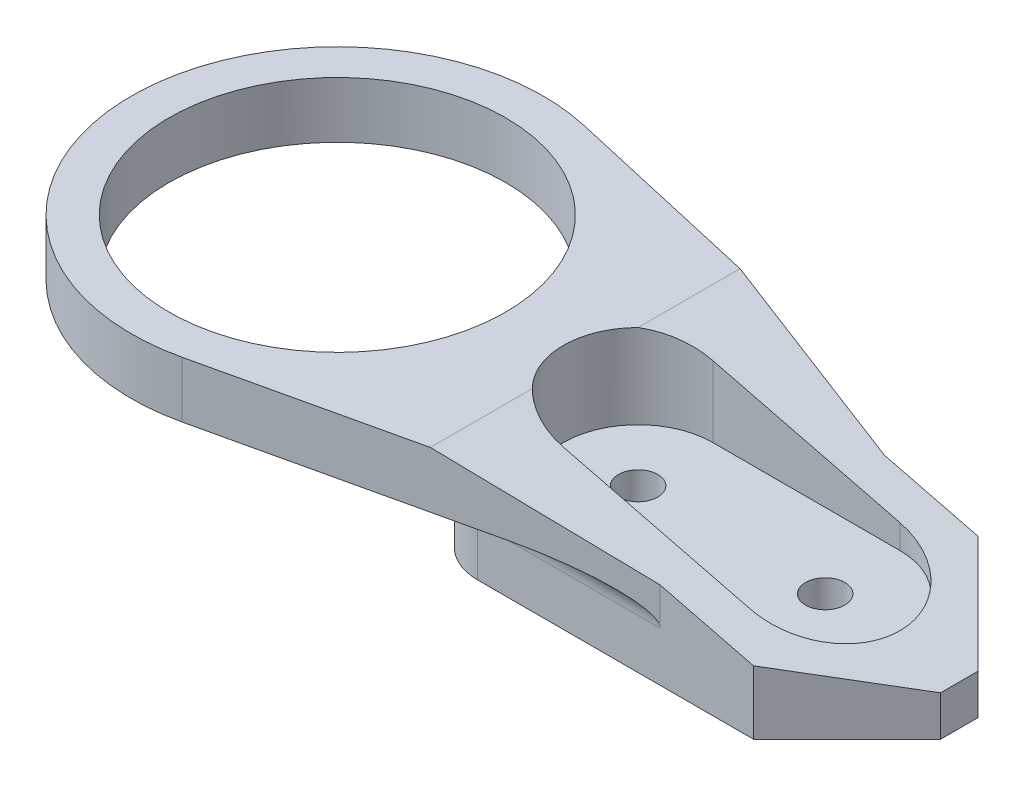
ISO-10303-21;
HEADER;
FILE_DESCRIPTION(('STEP AP214'),'2;1');
FILE_NAME('part.step','',(''),(''),'','','');
FILE_SCHEMA(('AUTOMOTIVE_DESIGN { 1 0 10303 214 1 1 1 1 }'));
ENDSEC;
DATA;
#1=APPLICATION_CONTEXT('core data for automotive mechanical design processes');
#2=APPLICATION_PROTOCOL_DEFINITION('international standard','automotive_design',2000,#1);
#3=PRODUCT_CONTEXT('',#1,'mechanical');
#4=PRODUCT('Part','Part','',(#3));
#5=PRODUCT_RELATED_PRODUCT_CATEGORY('part','',(#4));
#6=PRODUCT_DEFINITION_FORMATION('','',#4);
#7=PRODUCT_DEFINITION_CONTEXT('part definition',#1,'design');
#8=PRODUCT_DEFINITION('design','',#6,#7);
#9=PRODUCT_DEFINITION_SHAPE('','',#8);
#10=(LENGTH_UNIT() NAMED_UNIT(*) SI_UNIT(.MILLI.,.METRE.));
#11=(NAMED_UNIT(*) PLANE_ANGLE_UNIT() SI_UNIT($,.RADIAN.));
#12=(NAMED_UNIT(*) SI_UNIT($,.STERADIAN.) SOLID_ANGLE_UNIT());
#13=UNCERTAINTY_MEASURE_WITH_UNIT(LENGTH_MEASURE(1.E-05),#10,'distance_accuracy_value','');
#14=(GEOMETRIC_REPRESENTATION_CONTEXT(3) GLOBAL_UNCERTAINTY_ASSIGNED_CONTEXT((#13)) GLOBAL_UNIT_ASSIGNED_CONTEXT((#10,
#11,#12)) REPRESENTATION_CONTEXT('',''));
#15=CARTESIAN_POINT('',(0.,0.,0.));
#16=DIRECTION('',(0.,0.,1.));
#17=DIRECTION('',(1.,0.,0.));
#18=AXIS2_PLACEMENT_3D('',#15,#16,#17);
#19=CARTESIAN_POINT('',(17.8298933663439,-2.85,6.));
#20=DIRECTION('',(0.,1.,0.));
#21=DIRECTION('',(0.,0.,1.));
#22=AXIS2_PLACEMENT_3D('',#19,#20,#21);
#23=CYLINDRICAL_SURFACE('',#22,1.05);
#24=CARTESIAN_POINT('',(17.8298933663439,0.,6.));
#25=DIRECTION('',(0.,1.,0.));
#26=DIRECTION('',(-1.,0.,0.));
#27=AXIS2_PLACEMENT_3D('',#24,#25,#26);
#28=CIRCLE('',#27,1.05);
#29=CARTESIAN_POINT('',(16.7798933663439,0.,6.));
#30=VERTEX_POINT('',#29);
#31=EDGE_CURVE('E231',#30,#30,#28,.T.);
#32=ORIENTED_EDGE('',*,*,#31,.F.);
#33=EDGE_LOOP('',(#32));
#34=FACE_BOUND('',#33,.T.);
#35=CARTESIAN_POINT('',(17.8298933663439,2.65,6.));
#36=DIRECTION('',(0.,1.,0.));
#37=DIRECTION('',(0.,0.,1.));
#38=AXIS2_PLACEMENT_3D('',#35,#36,#37);
#39=CIRCLE('',#38,1.05);
#40=CARTESIAN_POINT('',(17.8298933663439,2.65,7.05));
#41=VERTEX_POINT('',#40);
#42=EDGE_CURVE('E228',#41,#41,#39,.F.);
#43=ORIENTED_EDGE('',*,*,#42,.F.);
#44=EDGE_LOOP('',(#43));
#45=FACE_BOUND('',#44,.T.);
#46=ADVANCED_FACE('F40',(#34,#45),#23,.F.);
#47=CARTESIAN_POINT('',(7.82989336634394,-2.85,6.));
#48=DIRECTION('',(0.,1.,0.));
#49=DIRECTION('',(0.,0.,1.));
#50=AXIS2_PLACEMENT_3D('',#47,#48,#49);
#51=CYLINDRICAL_SURFACE('',#50,1.05);
#52=CARTESIAN_POINT('',(7.82989336634394,0.,6.));
#53=DIRECTION('',(0.,1.,0.));
#54=DIRECTION('',(-1.,0.,0.));
#55=AXIS2_PLACEMENT_3D('',#52,#53,#54);
#56=CIRCLE('',#55,1.05);
#57=CARTESIAN_POINT('',(6.77989336634394,0.,6.));
#58=VERTEX_POINT('',#57);
#59=EDGE_CURVE('E234',#58,#58,#56,.T.);
#60=ORIENTED_EDGE('',*,*,#59,.F.);
#61=EDGE_LOOP('',(#60));
#62=FACE_BOUND('',#61,.T.);
#63=CARTESIAN_POINT('',(7.82989336634394,2.65,6.));
#64=DIRECTION('',(0.,1.,0.));
#65=DIRECTION('',(0.,0.,1.));
#66=AXIS2_PLACEMENT_3D('',#63,#64,#65);
#67=CIRCLE('',#66,1.05);
#68=CARTESIAN_POINT('',(7.82989336634394,2.65,7.05));
#69=VERTEX_POINT('',#68);
#70=EDGE_CURVE('E223',#69,#69,#67,.F.);
#71=ORIENTED_EDGE('',*,*,#70,.F.);
#72=EDGE_LOOP('',(#71));
#73=FACE_BOUND('',#72,.T.);
#74=ADVANCED_FACE('F465',(#62,#73),#51,.F.);
#75=CARTESIAN_POINT('',(0.,0.,12.));
#76=DIRECTION('',(0.,0.,-1.));
#77=DIRECTION('',(-1.,0.,0.));
#78=AXIS2_PLACEMENT_3D('',#75,#76,#77);
#79=PLANE('',#78);
#80=DIRECTION('',(0.,1.,0.));
#81=VECTOR('',#80,1.);
#82=CARTESIAN_POINT('',(15.,4.15,12.));
#83=LINE('',#82,#81);
#84=CARTESIAN_POINT('',(15.,2.65,12.));
#85=VERTEX_POINT('',#84);
#86=CARTESIAN_POINT('',(15.,4.64999999999996,12.));
#87=VERTEX_POINT('',#86);
#88=EDGE_CURVE('E263',#85,#87,#83,.T.);
#89=ORIENTED_EDGE('',*,*,#88,.F.);
#90=DIRECTION('',(1.,0.,0.));
#91=VECTOR('',#90,1.);
#92=CARTESIAN_POINT('',(5.25,2.65,12.));
#93=LINE('',#92,#91);
#94=CARTESIAN_POINT('',(5.25,2.65,12.));
#95=VERTEX_POINT('',#94);
#96=EDGE_CURVE('E349',#85,#95,#93,.F.);
#97=ORIENTED_EDGE('',*,*,#96,.T.);
#98=DIRECTION('',(0.,1.,0.));
#99=VECTOR('',#98,1.);
#100=CARTESIAN_POINT('',(5.25,0.,12.));
#101=LINE('',#100,#99);
#102=CARTESIAN_POINT('',(5.25,0.,12.));
#103=VERTEX_POINT('',#102);
#104=EDGE_CURVE('E328',#95,#103,#101,.F.);
#105=ORIENTED_EDGE('',*,*,#104,.T.);
#106=DIRECTION('',(1.,0.,0.));
#107=VECTOR('',#106,1.);
#108=CARTESIAN_POINT('',(25.,0.,12.));
#109=LINE('',#108,#107);
#110=CARTESIAN_POINT('',(20.,0.,12.));
#111=VERTEX_POINT('',#110);
#112=EDGE_CURVE('E271',#103,#111,#109,.T.);
#113=ORIENTED_EDGE('',*,*,#112,.T.);
#114=DIRECTION('',(0.,1.,0.));
#115=VECTOR('',#114,1.);
#116=CARTESIAN_POINT('',(20.,0.,12.));
#117=LINE('',#116,#115);
#118=CARTESIAN_POINT('',(20.,3.39999999999998,12.));
#119=VERTEX_POINT('',#118);
#120=EDGE_CURVE('E293',#111,#119,#117,.T.);
#121=ORIENTED_EDGE('',*,*,#120,.T.);
#122=DIRECTION('',(0.970142500145333,-0.24253562503633,0.));
#123=VECTOR('',#122,1.);
#124=CARTESIAN_POINT('',(4.99999999999971,7.15,12.));
#125=LINE('',#124,#123);
#126=EDGE_CURVE('E289',#119,#87,#125,.F.);
#127=ORIENTED_EDGE('',*,*,#126,.T.);
#128=EDGE_LOOP('',(#89,#97,#105,#113,#121,#127));
#129=FACE_BOUND('',#128,.T.);
#130=ADVANCED_FACE('F446',(#129),#79,.F.);
#131=CARTESIAN_POINT('',(25.,0.,12.));
#132=DIRECTION('',(0.,1.,0.));
#133=DIRECTION('',(-1.,0.,0.));
#134=AXIS2_PLACEMENT_3D('',#131,#132,#133);
#135=PLANE('',#134);
#136=ORIENTED_EDGE('',*,*,#59,.T.);
#137=EDGE_LOOP('',(#136));
#138=FACE_BOUND('',#137,.T.);
#139=ORIENTED_EDGE('',*,*,#31,.T.);
#140=EDGE_LOOP('',(#139));
#141=FACE_BOUND('',#140,.T.);
#142=ORIENTED_EDGE('',*,*,#112,.F.);
#143=CARTESIAN_POINT('',(5.25,0.,9.));
#144=DIRECTION('',(0.,1.,0.));
#145=DIRECTION('',(-1.,0.,0.));
#146=AXIS2_PLACEMENT_3D('',#143,#144,#145);
#147=CIRCLE('',#146,3.);
#148=CARTESIAN_POINT('',(2.25,0.,9.));
#149=VERTEX_POINT('',#148);
#150=EDGE_CURVE('E332',#103,#149,#147,.F.);
#151=ORIENTED_EDGE('',*,*,#150,.T.);
#152=DIRECTION('',(0.,0.,1.));
#153=VECTOR('',#152,1.);
#154=CARTESIAN_POINT('',(2.25,0.,12.));
#155=LINE('',#154,#153);
#156=CARTESIAN_POINT('',(2.25,0.,3.));
#157=VERTEX_POINT('',#156);
#158=EDGE_CURVE('E243',#157,#149,#155,.T.);
#159=ORIENTED_EDGE('',*,*,#158,.F.);
#160=CARTESIAN_POINT('',(5.25,0.,3.));
#161=DIRECTION('',(0.,1.,0.));
#162=DIRECTION('',(-1.,0.,0.));
#163=AXIS2_PLACEMENT_3D('',#160,#161,#162);
#164=CIRCLE('',#163,3.);
#165=CARTESIAN_POINT('',(5.25,0.,0.));
#166=VERTEX_POINT('',#165);
#167=EDGE_CURVE('E330',#157,#166,#164,.F.);
#168=ORIENTED_EDGE('',*,*,#167,.T.);
#169=DIRECTION('',(1.,0.,0.));
#170=VECTOR('',#169,1.);
#171=CARTESIAN_POINT('',(25.,0.,0.));
#172=LINE('',#171,#170);
#173=CARTESIAN_POINT('',(20.,0.,0.));
#174=VERTEX_POINT('',#173);
#175=EDGE_CURVE('E262',#166,#174,#172,.T.);
#176=ORIENTED_EDGE('',*,*,#175,.T.);
#177=DIRECTION('',(0.707106781186549,0.,0.707106781186547));
#178=VECTOR('',#177,1.);
#179=CARTESIAN_POINT('',(25.,0.,5.00000000000001));
#180=LINE('',#179,#178);
#181=CARTESIAN_POINT('',(25.,0.,5.00000000000001));
#182=VERTEX_POINT('',#181);
#183=EDGE_CURVE('E305',#174,#182,#180,.T.);
#184=ORIENTED_EDGE('',*,*,#183,.T.);
#185=DIRECTION('',(0.,0.,-1.));
#186=VECTOR('',#185,1.);
#187=CARTESIAN_POINT('',(25.,0.,12.));
#188=LINE('',#187,#186);
#189=CARTESIAN_POINT('',(25.,0.,6.99999999999997));
#190=VERTEX_POINT('',#189);
#191=EDGE_CURVE('E273',#190,#182,#188,.T.);
#192=ORIENTED_EDGE('',*,*,#191,.F.);
#193=DIRECTION('',(0.707106781186547,0.,-0.707106781186549));
#194=VECTOR('',#193,1.);
#195=CARTESIAN_POINT('',(20.,0.,12.));
#196=LINE('',#195,#194);
#197=EDGE_CURVE('E307',#190,#111,#196,.F.);
#198=ORIENTED_EDGE('',*,*,#197,.T.);
#199=EDGE_LOOP('',(#142,#151,#159,#168,#176,#184,#192,#198));
#200=FACE_BOUND('',#199,.T.);
#201=ADVANCED_FACE('F389',(#138,#141,#200),#135,.F.);
#202=CARTESIAN_POINT('',(0.,0.,0.));
#203=DIRECTION('',(0.,0.,-1.));
#204=DIRECTION('',(-1.,0.,0.));
#205=AXIS2_PLACEMENT_3D('',#202,#203,#204);
#206=PLANE('',#205);
#207=DIRECTION('',(0.,1.,0.));
#208=VECTOR('',#207,1.);
#209=CARTESIAN_POINT('',(5.25,0.,0.));
#210=LINE('',#209,#208);
#211=CARTESIAN_POINT('',(5.25,2.65,0.));
#212=VERTEX_POINT('',#211);
#213=EDGE_CURVE('E334',#166,#212,#210,.T.);
#214=ORIENTED_EDGE('',*,*,#213,.T.);
#215=DIRECTION('',(-1.,0.,0.));
#216=VECTOR('',#215,1.);
#217=CARTESIAN_POINT('',(0.,2.65,0.));
#218=LINE('',#217,#216);
#219=CARTESIAN_POINT('',(15.,2.65,0.));
#220=VERTEX_POINT('',#219);
#221=EDGE_CURVE('E356',#212,#220,#218,.F.);
#222=ORIENTED_EDGE('',*,*,#221,.T.);
#223=DIRECTION('',(0.,1.,0.));
#224=VECTOR('',#223,1.);
#225=CARTESIAN_POINT('',(15.,4.15,0.));
#226=LINE('',#225,#224);
#227=CARTESIAN_POINT('',(15.,4.64999999999996,0.));
#228=VERTEX_POINT('',#227);
#229=EDGE_CURVE('E56',#220,#228,#226,.T.);
#230=ORIENTED_EDGE('',*,*,#229,.T.);
#231=DIRECTION('',(-0.970142500145333,0.24253562503633,0.));
#232=VECTOR('',#231,1.);
#233=CARTESIAN_POINT('',(1.97647058823525,7.9058823529411,0.));
#234=LINE('',#233,#232);
#235=CARTESIAN_POINT('',(20.,3.39999999999998,0.));
#236=VERTEX_POINT('',#235);
#237=EDGE_CURVE('E283',#228,#236,#234,.F.);
#238=ORIENTED_EDGE('',*,*,#237,.T.);
#239=DIRECTION('',(0.,-1.,0.));
#240=VECTOR('',#239,1.);
#241=CARTESIAN_POINT('',(20.,0.,0.));
#242=LINE('',#241,#240);
#243=EDGE_CURVE('E310',#236,#174,#242,.T.);
#244=ORIENTED_EDGE('',*,*,#243,.T.);
#245=ORIENTED_EDGE('',*,*,#175,.F.);
#246=EDGE_LOOP('',(#214,#222,#230,#238,#244,#245));
#247=FACE_BOUND('',#246,.T.);
#248=ADVANCED_FACE('F381',(#247),#206,.T.);
#249=CARTESIAN_POINT('',(25.,7.15,12.));
#250=DIRECTION('',(-1.,0.,0.));
#251=DIRECTION('',(0.,0.,1.));
#252=AXIS2_PLACEMENT_3D('',#249,#250,#251);
#253=PLANE('',#252);
#254=DIRECTION('',(0.,0.,1.));
#255=VECTOR('',#254,1.);
#256=CARTESIAN_POINT('',(25.,2.14999999999999,12.));
#257=LINE('',#256,#255);
#258=CARTESIAN_POINT('',(25.,2.14999999999999,5.00000000000001));
#259=VERTEX_POINT('',#258);
#260=CARTESIAN_POINT('',(25.,2.14999999999999,6.99999999999997));
#261=VERTEX_POINT('',#260);
#262=EDGE_CURVE('E286',#259,#261,#257,.T.);
#263=ORIENTED_EDGE('',*,*,#262,.T.);
#264=DIRECTION('',(0.,-1.,0.));
#265=VECTOR('',#264,1.);
#266=CARTESIAN_POINT('',(25.,7.15,6.99999999999997));
#267=LINE('',#266,#265);
#268=EDGE_CURVE('E303',#261,#190,#267,.T.);
#269=ORIENTED_EDGE('',*,*,#268,.T.);
#270=ORIENTED_EDGE('',*,*,#191,.T.);
#271=DIRECTION('',(0.,1.,0.));
#272=VECTOR('',#271,1.);
#273=CARTESIAN_POINT('',(25.,2.14999999999999,5.00000000000001));
#274=LINE('',#273,#272);
#275=EDGE_CURVE('E300',#182,#259,#274,.T.);
#276=ORIENTED_EDGE('',*,*,#275,.T.);
#277=EDGE_LOOP('',(#263,#269,#270,#276));
#278=FACE_BOUND('',#277,.T.);
#279=ADVANCED_FACE('F440',(#278),#253,.F.);
#280=CARTESIAN_POINT('',(0.,7.15,12.));
#281=DIRECTION('',(0.,-1.,0.));
#282=DIRECTION('',(0.,0.,-1.));
#283=AXIS2_PLACEMENT_3D('',#280,#281,#282);
#284=PLANE('',#283);
#285=CARTESIAN_POINT('',(-8.25,7.15,6.));
#286=DIRECTION('',(0.,-1.,0.));
#287=DIRECTION('',(0.,0.,-1.));
#288=AXIS2_PLACEMENT_3D('',#285,#286,#287);
#289=CIRCLE('',#288,9.);
#290=CARTESIAN_POINT('',(-8.25,7.15,-3.));
#291=VERTEX_POINT('',#290);
#292=EDGE_CURVE('E240',#291,#291,#289,.T.);
#293=ORIENTED_EDGE('',*,*,#292,.T.);
#294=EDGE_LOOP('',(#293));
#295=FACE_BOUND('',#294,.T.);
#296=DIRECTION('',(0.,0.,-1.));
#297=VECTOR('',#296,1.);
#298=CARTESIAN_POINT('',(4.99999999999971,7.15,12.));
#299=LINE('',#298,#297);
#300=CARTESIAN_POINT('',(4.99999999999971,7.15,14.2771102196746));
#301=VERTEX_POINT('',#300);
#302=CARTESIAN_POINT('',(4.99999999999971,7.15,8.82696012266195));
#303=VERTEX_POINT('',#302);
#304=EDGE_CURVE('E278',#301,#303,#299,.T.);
#305=ORIENTED_EDGE('',*,*,#304,.T.);
#306=CARTESIAN_POINT('',(7.82989336634394,7.15,6.));
#307=DIRECTION('',(0.,1.,0.));
#308=DIRECTION('',(0.,0.,1.));
#309=AXIS2_PLACEMENT_3D('',#306,#307,#308);
#310=CIRCLE('',#309,4.);
#311=CARTESIAN_POINT('',(4.99999999999971,7.15,3.17303987733804));
#312=VERTEX_POINT('',#311);
#313=EDGE_CURVE('E215',#312,#303,#310,.T.);
#314=ORIENTED_EDGE('',*,*,#313,.F.);
#315=CARTESIAN_POINT('',(4.99999999999971,7.15,-2.27711021967455));
#316=VERTEX_POINT('',#315);
#317=EDGE_CURVE('E277',#312,#316,#299,.T.);
#318=ORIENTED_EDGE('',*,*,#317,.T.);
#319=DIRECTION('',(-0.975040415413256,0.,-0.222027449453318));
#320=VECTOR('',#319,1.);
#321=CARTESIAN_POINT('',(0.739442824661187,7.15,-3.24728604822164));
#322=LINE('',#321,#320);
#323=CARTESIAN_POINT('',(-5.80494920248651,7.15,-4.73751624487906));
#324=VERTEX_POINT('',#323);
#325=EDGE_CURVE('E246',#316,#324,#322,.T.);
#326=ORIENTED_EDGE('',*,*,#325,.T.);
#327=CARTESIAN_POINT('',(-8.25,7.15,6.));
#328=DIRECTION('',(0.,1.,0.));
#329=DIRECTION('',(0.,0.,1.));
#330=AXIS2_PLACEMENT_3D('',#327,#328,#329);
#331=CIRCLE('',#330,11.0123806922692);
#332=CARTESIAN_POINT('',(-5.80494920248651,7.15,16.7375162448791));
#333=VERTEX_POINT('',#332);
#334=EDGE_CURVE('E257',#324,#333,#331,.T.);
#335=ORIENTED_EDGE('',*,*,#334,.T.);
#336=DIRECTION('',(-0.975040415413256,0.,0.222027449453318));
#337=VECTOR('',#336,1.);
#338=CARTESIAN_POINT('',(3.3372716632385,7.15,14.6557317884927));
#339=LINE('',#338,#337);
#340=EDGE_CURVE('E250',#301,#333,#339,.T.);
#341=ORIENTED_EDGE('',*,*,#340,.F.);
#342=EDGE_LOOP('',(#305,#314,#318,#326,#335,#341));
#343=FACE_BOUND('',#342,.T.);
#344=ADVANCED_FACE('F423',(#295,#343),#284,.F.);
#345=CARTESIAN_POINT('',(0.739442824661187,4.15,-3.24728604822164));
#346=DIRECTION('',(0.222027449453318,0.,-0.975040415413256));
#347=DIRECTION('',(-0.975040415413256,0.,-0.222027449453318));
#348=AXIS2_PLACEMENT_3D('',#345,#346,#347);
#349=PLANE('',#348);
#350=ORIENTED_EDGE('',*,*,#325,.F.);
#351=DIRECTION('',(-0.947302626103098,0.236825656525771,-0.215711249102385));
#352=VECTOR('',#351,1.);
#353=CARTESIAN_POINT('',(1.65143880185032,7.98714029953734,-3.0396145122257));
#354=LINE('',#353,#352);
#355=EDGE_CURVE('E281',#316,#228,#354,.F.);
#356=ORIENTED_EDGE('',*,*,#355,.T.);
#357=ORIENTED_EDGE('',*,*,#229,.F.);
#358=CARTESIAN_POINT('',(8.41270357912484,2.65,-1.5));
#359=DIRECTION('',(0.222027449453318,0.,-0.975040415413256));
#360=DIRECTION('',(-0.975040415413256,0.,-0.222027449453318));
#361=AXIS2_PLACEMENT_3D('',#358,#359,#360);
#362=ELLIPSE('',#361,6.75592141284034,1.5);
#363=CARTESIAN_POINT('',(8.41270357912484,4.15,-1.5));
#364=VERTEX_POINT('',#363);
#365=EDGE_CURVE('E11',#220,#364,#362,.F.);
#366=ORIENTED_EDGE('',*,*,#365,.T.);
#367=DIRECTION('',(-0.975040415413256,0.,-0.222027449453318));
#368=VECTOR('',#367,1.);
#369=CARTESIAN_POINT('',(0.739442824661187,4.15,-3.24728604822164));
#370=LINE('',#369,#368);
#371=CARTESIAN_POINT('',(-5.80494920248651,4.15,-4.73751624487906));
#372=VERTEX_POINT('',#371);
#373=EDGE_CURVE('E247',#364,#372,#370,.T.);
#374=ORIENTED_EDGE('',*,*,#373,.T.);
#375=DIRECTION('',(0.,1.,0.));
#376=VECTOR('',#375,1.);
#377=CARTESIAN_POINT('',(-5.80494920248651,4.15,-4.73751624487906));
#378=LINE('',#377,#376);
#379=EDGE_CURVE('E255',#372,#324,#378,.T.);
#380=ORIENTED_EDGE('',*,*,#379,.T.);
#381=EDGE_LOOP('',(#350,#356,#357,#366,#374,#380));
#382=FACE_BOUND('',#381,.T.);
#383=ADVANCED_FACE('F421',(#382),#349,.T.);
#384=CARTESIAN_POINT('',(3.3372716632385,4.15,14.6557317884927));
#385=DIRECTION('',(-0.222027449453318,0.,-0.975040415413256));
#386=DIRECTION('',(-0.975040415413256,0.,0.222027449453318));
#387=AXIS2_PLACEMENT_3D('',#384,#385,#386);
#388=PLANE('',#387);
#389=ORIENTED_EDGE('',*,*,#88,.T.);
#390=DIRECTION('',(0.947302626103098,-0.236825656525771,-0.215711249102385));
#391=VECTOR('',#390,1.);
#392=CARTESIAN_POINT('',(5.46531342989284,7.03367164252672,14.1711532230184));
#393=LINE('',#392,#391);
#394=EDGE_CURVE('E291',#87,#301,#393,.F.);
#395=ORIENTED_EDGE('',*,*,#394,.T.);
#396=ORIENTED_EDGE('',*,*,#340,.T.);
#397=DIRECTION('',(0.,1.,0.));
#398=VECTOR('',#397,1.);
#399=CARTESIAN_POINT('',(-5.80494920248651,4.15,16.7375162448791));
#400=LINE('',#399,#398);
#401=CARTESIAN_POINT('',(-5.80494920248651,4.15,16.7375162448791));
#402=VERTEX_POINT('',#401);
#403=EDGE_CURVE('E266',#402,#333,#400,.T.);
#404=ORIENTED_EDGE('',*,*,#403,.F.);
#405=DIRECTION('',(-0.975040415413256,0.,0.222027449453318));
#406=VECTOR('',#405,1.);
#407=CARTESIAN_POINT('',(3.3372716632385,4.15,14.6557317884927));
#408=LINE('',#407,#406);
#409=CARTESIAN_POINT('',(8.41270357912485,4.15,13.5));
#410=VERTEX_POINT('',#409);
#411=EDGE_CURVE('E253',#410,#402,#408,.T.);
#412=ORIENTED_EDGE('',*,*,#411,.F.);
#413=CARTESIAN_POINT('',(8.41270357912485,2.65,13.5));
#414=DIRECTION('',(-0.222027449453318,0.,-0.975040415413256));
#415=DIRECTION('',(-0.975040415413256,0.,0.222027449453318));
#416=AXIS2_PLACEMENT_3D('',#413,#414,#415);
#417=ELLIPSE('',#416,6.75592141284034,1.5);
#418=EDGE_CURVE('E49',#410,#85,#417,.T.);
#419=ORIENTED_EDGE('',*,*,#418,.T.);
#420=EDGE_LOOP('',(#389,#395,#396,#404,#412,#419));
#421=FACE_BOUND('',#420,.T.);
#422=ADVANCED_FACE('F413',(#421),#388,.F.);
#423=CARTESIAN_POINT('',(-8.25,4.15,6.));
#424=DIRECTION('',(0.,1.,0.));
#425=DIRECTION('',(0.,0.,1.));
#426=AXIS2_PLACEMENT_3D('',#423,#424,#425);
#427=CYLINDRICAL_SURFACE('',#426,11.0123806922692);
#428=ORIENTED_EDGE('',*,*,#334,.F.);
#429=ORIENTED_EDGE('',*,*,#379,.F.);
#430=CARTESIAN_POINT('',(-8.25,4.15,6.));
#431=DIRECTION('',(0.,1.,0.));
#432=DIRECTION('',(0.,0.,1.));
#433=AXIS2_PLACEMENT_3D('',#430,#431,#432);
#434=CIRCLE('',#433,11.0123806922692);
#435=EDGE_CURVE('E249',#372,#402,#434,.T.);
#436=ORIENTED_EDGE('',*,*,#435,.T.);
#437=ORIENTED_EDGE('',*,*,#403,.T.);
#438=EDGE_LOOP('',(#428,#429,#436,#437));
#439=FACE_BOUND('',#438,.T.);
#440=ADVANCED_FACE('F418',(#439),#427,.T.);
#441=CARTESIAN_POINT('',(0.,4.15,0.));
#442=DIRECTION('',(0.,1.,0.));
#443=DIRECTION('',(0.,0.,1.));
#444=AXIS2_PLACEMENT_3D('',#441,#442,#443);
#445=PLANE('',#444);
#446=CARTESIAN_POINT('',(5.25,4.15,9.));
#447=DIRECTION('',(0.,1.,0.));
#448=DIRECTION('',(0.,0.,1.));
#449=AXIS2_PLACEMENT_3D('',#446,#447,#448);
#450=CIRCLE('',#449,4.5);
#451=CARTESIAN_POINT('',(0.75,4.15,9.));
#452=VERTEX_POINT('',#451);
#453=CARTESIAN_POINT('',(5.25,4.15,13.5));
#454=VERTEX_POINT('',#453);
#455=EDGE_CURVE('E344',#452,#454,#450,.T.);
#456=ORIENTED_EDGE('',*,*,#455,.T.);
#457=DIRECTION('',(1.,0.,0.));
#458=VECTOR('',#457,1.);
#459=CARTESIAN_POINT('',(15.,4.15,13.5));
#460=LINE('',#459,#458);
#461=EDGE_CURVE('E346',#454,#410,#460,.T.);
#462=ORIENTED_EDGE('',*,*,#461,.T.);
#463=ORIENTED_EDGE('',*,*,#411,.T.);
#464=ORIENTED_EDGE('',*,*,#435,.F.);
#465=ORIENTED_EDGE('',*,*,#373,.F.);
#466=DIRECTION('',(-1.,0.,0.));
#467=VECTOR('',#466,1.);
#468=CARTESIAN_POINT('',(0.,4.15,-1.5));
#469=LINE('',#468,#467);
#470=CARTESIAN_POINT('',(5.25,4.15,-1.5));
#471=VERTEX_POINT('',#470);
#472=EDGE_CURVE('E336',#364,#471,#469,.T.);
#473=ORIENTED_EDGE('',*,*,#472,.T.);
#474=CARTESIAN_POINT('',(5.25,4.15,3.));
#475=DIRECTION('',(0.,1.,0.));
#476=DIRECTION('',(0.,0.,1.));
#477=AXIS2_PLACEMENT_3D('',#474,#475,#476);
#478=CIRCLE('',#477,4.5);
#479=CARTESIAN_POINT('',(0.75,4.15,3.));
#480=VERTEX_POINT('',#479);
#481=EDGE_CURVE('E338',#471,#480,#478,.T.);
#482=ORIENTED_EDGE('',*,*,#481,.T.);
#483=DIRECTION('',(0.,0.,1.));
#484=VECTOR('',#483,1.);
#485=CARTESIAN_POINT('',(0.75,4.15,0.));
#486=LINE('',#485,#484);
#487=CARTESIAN_POINT('',(0.750000000000001,4.15,6.));
#488=VERTEX_POINT('',#487);
#489=EDGE_CURVE('E340',#480,#488,#486,.T.);
#490=ORIENTED_EDGE('',*,*,#489,.T.);
#491=CARTESIAN_POINT('',(-8.25,4.15,6.));
#492=DIRECTION('',(0.,-1.,0.));
#493=DIRECTION('',(0.,0.,-1.));
#494=AXIS2_PLACEMENT_3D('',#491,#492,#493);
#495=CIRCLE('',#494,9.);
#496=EDGE_CURVE('E237',#488,#488,#495,.T.);
#497=ORIENTED_EDGE('',*,*,#496,.F.);
#498=DIRECTION('',(0.,0.,1.));
#499=VECTOR('',#498,1.);
#500=CARTESIAN_POINT('',(0.75,4.15,0.));
#501=LINE('',#500,#499);
#502=EDGE_CURVE('E342',#488,#452,#501,.T.);
#503=ORIENTED_EDGE('',*,*,#502,.T.);
#504=EDGE_LOOP('',(#456,#462,#463,#464,#465,#473,#482,#490,#497,#503));
#505=FACE_BOUND('',#504,.T.);
#506=ADVANCED_FACE('F409',(#505),#445,.F.);
#507=CARTESIAN_POINT('',(2.25,-16.85,6.));
#508=DIRECTION('',(-1.,0.,0.));
#509=DIRECTION('',(0.,0.,1.));
#510=AXIS2_PLACEMENT_3D('',#507,#508,#509);
#511=PLANE('',#510);
#512=DIRECTION('',(0.,1.,0.));
#513=VECTOR('',#512,1.);
#514=CARTESIAN_POINT('',(2.25,4.15,9.));
#515=LINE('',#514,#513);
#516=CARTESIAN_POINT('',(2.25,2.65,9.));
#517=VERTEX_POINT('',#516);
#518=EDGE_CURVE('E325',#149,#517,#515,.T.);
#519=ORIENTED_EDGE('',*,*,#518,.T.);
#520=DIRECTION('',(0.,0.,1.));
#521=VECTOR('',#520,1.);
#522=CARTESIAN_POINT('',(2.25,2.65,6.));
#523=LINE('',#522,#521);
#524=CARTESIAN_POINT('',(2.25,2.65,3.));
#525=VERTEX_POINT('',#524);
#526=EDGE_CURVE('E353',#517,#525,#523,.F.);
#527=ORIENTED_EDGE('',*,*,#526,.T.);
#528=DIRECTION('',(0.,1.,0.));
#529=VECTOR('',#528,1.);
#530=CARTESIAN_POINT('',(2.25,-16.85,3.));
#531=LINE('',#530,#529);
#532=EDGE_CURVE('E323',#525,#157,#531,.F.);
#533=ORIENTED_EDGE('',*,*,#532,.T.);
#534=ORIENTED_EDGE('',*,*,#158,.T.);
#535=EDGE_LOOP('',(#519,#527,#533,#534));
#536=FACE_BOUND('',#535,.T.);
#537=ADVANCED_FACE('F393',(#536),#511,.T.);
#538=CARTESIAN_POINT('',(-8.25,14.15,6.));
#539=DIRECTION('',(0.,-1.,0.));
#540=DIRECTION('',(0.,0.,-1.));
#541=AXIS2_PLACEMENT_3D('',#538,#539,#540);
#542=CYLINDRICAL_SURFACE('',#541,9.);
#543=ORIENTED_EDGE('',*,*,#496,.T.);
#544=EDGE_LOOP('',(#543));
#545=FACE_BOUND('',#544,.T.);
#546=ORIENTED_EDGE('',*,*,#292,.F.);
#547=EDGE_LOOP('',(#546));
#548=FACE_BOUND('',#547,.T.);
#549=ADVANCED_FACE('F477',(#545,#548),#542,.F.);
#550=CARTESIAN_POINT('',(4.99999999999971,7.15,12.));
#551=DIRECTION('',(-0.24253562503633,-0.970142500145333,0.));
#552=DIRECTION('',(0.,0.,-1.));
#553=AXIS2_PLACEMENT_3D('',#550,#551,#552);
#554=PLANE('',#553);
#555=CARTESIAN_POINT('',(7.82989336634394,6.44252665841395,6.));
#556=DIRECTION('',(-0.24253562503633,-0.970142500145333,0.));
#557=DIRECTION('',(-0.970142500145333,0.24253562503633,0.));
#558=AXIS2_PLACEMENT_3D('',#555,#556,#557);
#559=ELLIPSE('',#558,4.12310562561766,4.);
#560=CARTESIAN_POINT('',(7.82989336634394,6.44252665841395,10.));
#561=VERTEX_POINT('',#560);
#562=EDGE_CURVE('E197',#303,#561,#559,.F.);
#563=ORIENTED_EDGE('',*,*,#562,.F.);
#564=ORIENTED_EDGE('',*,*,#304,.F.);
#565=ORIENTED_EDGE('',*,*,#394,.F.);
#566=ORIENTED_EDGE('',*,*,#126,.F.);
#567=DIRECTION('',(0.696310623822791,-0.174077655955695,-0.696310623822793));
#568=VECTOR('',#567,1.);
#569=CARTESIAN_POINT('',(12.2727272727271,5.33181818181817,19.7272727272729));
#570=LINE('',#569,#568);
#571=EDGE_CURVE('E298',#119,#261,#570,.T.);
#572=ORIENTED_EDGE('',*,*,#571,.T.);
#573=ORIENTED_EDGE('',*,*,#262,.F.);
#574=DIRECTION('',(0.696310623822793,-0.174077655955696,0.696310623822791));
#575=VECTOR('',#574,1.);
#576=CARTESIAN_POINT('',(18.0909090909089,3.87727272727274,-1.90909090909105));
#577=LINE('',#576,#575);
#578=EDGE_CURVE('E296',#259,#236,#577,.F.);
#579=ORIENTED_EDGE('',*,*,#578,.T.);
#580=ORIENTED_EDGE('',*,*,#237,.F.);
#581=ORIENTED_EDGE('',*,*,#355,.F.);
#582=ORIENTED_EDGE('',*,*,#317,.F.);
#583=CARTESIAN_POINT('',(7.82989336634394,6.44252665841395,2.));
#584=VERTEX_POINT('',#583);
#585=EDGE_CURVE('E321',#584,#312,#559,.F.);
#586=ORIENTED_EDGE('',*,*,#585,.F.);
#587=DIRECTION('',(0.970142500145333,-0.24253562503633,0.));
#588=VECTOR('',#587,1.);
#589=CARTESIAN_POINT('',(4.99999999999971,7.15,2.));
#590=LINE('',#589,#588);
#591=CARTESIAN_POINT('',(17.8298933663439,3.94252665841398,2.));
#592=VERTEX_POINT('',#591);
#593=EDGE_CURVE('E319',#592,#584,#590,.F.);
#594=ORIENTED_EDGE('',*,*,#593,.F.);
#595=CARTESIAN_POINT('',(17.8298933663439,3.94252665841398,6.));
#596=DIRECTION('',(-0.24253562503633,-0.970142500145333,0.));
#597=DIRECTION('',(-0.970142500145333,0.24253562503633,0.));
#598=AXIS2_PLACEMENT_3D('',#595,#596,#597);
#599=ELLIPSE('',#598,4.12310562561766,4.);
#600=CARTESIAN_POINT('',(17.8298933663439,3.94252665841398,10.));
#601=VERTEX_POINT('',#600);
#602=EDGE_CURVE('E317',#601,#592,#599,.F.);
#603=ORIENTED_EDGE('',*,*,#602,.F.);
#604=DIRECTION('',(-0.970142500145333,0.24253562503633,0.));
#605=VECTOR('',#604,1.);
#606=CARTESIAN_POINT('',(4.99999999999971,7.15,10.));
#607=LINE('',#606,#605);
#608=EDGE_CURVE('E313',#561,#601,#607,.F.);
#609=ORIENTED_EDGE('',*,*,#608,.F.);
#610=EDGE_LOOP('',(#563,#564,#565,#566,#572,#573,#579,#580,#581,#582,#586,#594,#603,#609));
#611=FACE_BOUND('',#610,.T.);
#612=ADVANCED_FACE('F430',(#611),#554,.F.);
#613=CARTESIAN_POINT('',(20.,0.,12.));
#614=DIRECTION('',(-0.707106781186549,0.,-0.707106781186547));
#615=DIRECTION('',(0.,1.,0.));
#616=AXIS2_PLACEMENT_3D('',#613,#614,#615);
#617=PLANE('',#616);
#618=ORIENTED_EDGE('',*,*,#197,.F.);
#619=ORIENTED_EDGE('',*,*,#268,.F.);
#620=ORIENTED_EDGE('',*,*,#571,.F.);
#621=ORIENTED_EDGE('',*,*,#120,.F.);
#622=EDGE_LOOP('',(#618,#619,#620,#621));
#623=FACE_BOUND('',#622,.T.);
#624=ADVANCED_FACE('F443',(#623),#617,.F.);
#625=CARTESIAN_POINT('',(25.,7.15,5.00000000000001));
#626=DIRECTION('',(0.707106781186547,0.,-0.707106781186549));
#627=DIRECTION('',(0.,-1.,0.));
#628=AXIS2_PLACEMENT_3D('',#625,#626,#627);
#629=PLANE('',#628);
#630=ORIENTED_EDGE('',*,*,#183,.F.);
#631=ORIENTED_EDGE('',*,*,#243,.F.);
#632=ORIENTED_EDGE('',*,*,#578,.F.);
#633=ORIENTED_EDGE('',*,*,#275,.F.);
#634=EDGE_LOOP('',(#630,#631,#632,#633));
#635=FACE_BOUND('',#634,.T.);
#636=ADVANCED_FACE('F435',(#635),#629,.T.);
#637=CARTESIAN_POINT('',(7.82989336634394,2.65,6.));
#638=DIRECTION('',(0.,1.,0.));
#639=DIRECTION('',(0.,0.,1.));
#640=AXIS2_PLACEMENT_3D('',#637,#638,#639);
#641=PLANE('',#640);
#642=CARTESIAN_POINT('',(7.82989336634394,2.65,6.));
#643=DIRECTION('',(0.,1.,0.));
#644=DIRECTION('',(0.,0.,1.));
#645=AXIS2_PLACEMENT_3D('',#642,#643,#644);
#646=CIRCLE('',#645,4.);
#647=CARTESIAN_POINT('',(7.82989336634394,2.65,2.));
#648=VERTEX_POINT('',#647);
#649=CARTESIAN_POINT('',(7.82989336634394,2.65,10.));
#650=VERTEX_POINT('',#649);
#651=EDGE_CURVE('E194',#648,#650,#646,.T.);
#652=ORIENTED_EDGE('',*,*,#651,.T.);
#653=DIRECTION('',(1.,0.,0.));
#654=VECTOR('',#653,1.);
#655=CARTESIAN_POINT('',(17.8298933663439,2.65,10.));
#656=LINE('',#655,#654);
#657=CARTESIAN_POINT('',(17.8298933663439,2.65,10.));
#658=VERTEX_POINT('',#657);
#659=EDGE_CURVE('E204',#650,#658,#656,.T.);
#660=ORIENTED_EDGE('',*,*,#659,.T.);
#661=CARTESIAN_POINT('',(17.8298933663439,2.65,6.));
#662=DIRECTION('',(0.,1.,0.));
#663=DIRECTION('',(0.,0.,1.));
#664=AXIS2_PLACEMENT_3D('',#661,#662,#663);
#665=CIRCLE('',#664,4.);
#666=CARTESIAN_POINT('',(17.8298933663439,2.65,2.));
#667=VERTEX_POINT('',#666);
#668=EDGE_CURVE('E210',#658,#667,#665,.T.);
#669=ORIENTED_EDGE('',*,*,#668,.T.);
#670=DIRECTION('',(-1.,0.,0.));
#671=VECTOR('',#670,1.);
#672=CARTESIAN_POINT('',(7.82989336634394,2.65,2.));
#673=LINE('',#672,#671);
#674=EDGE_CURVE('E201',#667,#648,#673,.T.);
#675=ORIENTED_EDGE('',*,*,#674,.T.);
#676=EDGE_LOOP('',(#652,#660,#669,#675));
#677=FACE_BOUND('',#676,.T.);
#678=ORIENTED_EDGE('',*,*,#70,.T.);
#679=EDGE_LOOP('',(#678));
#680=FACE_BOUND('',#679,.T.);
#681=ORIENTED_EDGE('',*,*,#42,.T.);
#682=EDGE_LOOP('',(#681));
#683=FACE_BOUND('',#682,.T.);
#684=ADVANCED_FACE('F212',(#677,#680,#683),#641,.T.);
#685=CARTESIAN_POINT('',(7.82989336634394,2.65,6.));
#686=DIRECTION('',(0.,1.,0.));
#687=DIRECTION('',(0.,0.,1.));
#688=AXIS2_PLACEMENT_3D('',#685,#686,#687);
#689=CYLINDRICAL_SURFACE('',#688,4.);
#690=ORIENTED_EDGE('',*,*,#562,.T.);
#691=DIRECTION('',(0.,1.,0.));
#692=VECTOR('',#691,1.);
#693=CARTESIAN_POINT('',(7.82989336634394,2.65,10.));
#694=LINE('',#693,#692);
#695=EDGE_CURVE('E189',#650,#561,#694,.T.);
#696=ORIENTED_EDGE('',*,*,#695,.F.);
#697=ORIENTED_EDGE('',*,*,#651,.F.);
#698=DIRECTION('',(0.,1.,0.));
#699=VECTOR('',#698,1.);
#700=CARTESIAN_POINT('',(7.82989336634394,2.65,2.));
#701=LINE('',#700,#699);
#702=EDGE_CURVE('E221',#648,#584,#701,.T.);
#703=ORIENTED_EDGE('',*,*,#702,.T.);
#704=ORIENTED_EDGE('',*,*,#585,.T.);
#705=ORIENTED_EDGE('',*,*,#313,.T.);
#706=EDGE_LOOP('',(#690,#696,#697,#703,#704,#705));
#707=FACE_BOUND('',#706,.T.);
#708=ADVANCED_FACE('F191',(#707),#689,.F.);
#709=CARTESIAN_POINT('',(7.82989336634394,2.65,2.));
#710=DIRECTION('',(0.,0.,-1.));
#711=DIRECTION('',(-1.,0.,0.));
#712=AXIS2_PLACEMENT_3D('',#709,#710,#711);
#713=PLANE('',#712);
#714=ORIENTED_EDGE('',*,*,#593,.T.);
#715=ORIENTED_EDGE('',*,*,#702,.F.);
#716=ORIENTED_EDGE('',*,*,#674,.F.);
#717=DIRECTION('',(0.,1.,0.));
#718=VECTOR('',#717,1.);
#719=CARTESIAN_POINT('',(17.8298933663439,2.65,2.));
#720=LINE('',#719,#718);
#721=EDGE_CURVE('E224',#667,#592,#720,.T.);
#722=ORIENTED_EDGE('',*,*,#721,.T.);
#723=EDGE_LOOP('',(#714,#715,#716,#722));
#724=FACE_BOUND('',#723,.T.);
#725=ADVANCED_FACE('F454',(#724),#713,.F.);
#726=CARTESIAN_POINT('',(17.8298933663439,2.65,6.));
#727=DIRECTION('',(0.,1.,0.));
#728=DIRECTION('',(0.,0.,1.));
#729=AXIS2_PLACEMENT_3D('',#726,#727,#728);
#730=CYLINDRICAL_SURFACE('',#729,4.);
#731=ORIENTED_EDGE('',*,*,#602,.T.);
#732=ORIENTED_EDGE('',*,*,#721,.F.);
#733=ORIENTED_EDGE('',*,*,#668,.F.);
#734=DIRECTION('',(0.,1.,0.));
#735=VECTOR('',#734,1.);
#736=CARTESIAN_POINT('',(17.8298933663439,2.65,10.));
#737=LINE('',#736,#735);
#738=EDGE_CURVE('E200',#658,#601,#737,.T.);
#739=ORIENTED_EDGE('',*,*,#738,.T.);
#740=EDGE_LOOP('',(#731,#732,#733,#739));
#741=FACE_BOUND('',#740,.T.);
#742=ADVANCED_FACE('F452',(#741),#730,.F.);
#743=CARTESIAN_POINT('',(17.8298933663439,2.65,10.));
#744=DIRECTION('',(0.,0.,1.));
#745=DIRECTION('',(1.,0.,0.));
#746=AXIS2_PLACEMENT_3D('',#743,#744,#745);
#747=PLANE('',#746);
#748=ORIENTED_EDGE('',*,*,#608,.T.);
#749=ORIENTED_EDGE('',*,*,#738,.F.);
#750=ORIENTED_EDGE('',*,*,#659,.F.);
#751=ORIENTED_EDGE('',*,*,#695,.T.);
#752=EDGE_LOOP('',(#748,#749,#750,#751));
#753=FACE_BOUND('',#752,.T.);
#754=ADVANCED_FACE('F205',(#753),#747,.F.);
#755=CARTESIAN_POINT('',(5.25,-16.85,9.));
#756=DIRECTION('',(0.,-1.,0.));
#757=DIRECTION('',(0.,0.,-1.));
#758=AXIS2_PLACEMENT_3D('',#755,#756,#757);
#759=CYLINDRICAL_SURFACE('',#758,3.);
#760=ORIENTED_EDGE('',*,*,#104,.F.);
#761=CARTESIAN_POINT('',(5.25,2.65,9.));
#762=DIRECTION('',(0.,1.,0.));
#763=DIRECTION('',(0.,0.,1.));
#764=AXIS2_PLACEMENT_3D('',#761,#762,#763);
#765=CIRCLE('',#764,3.);
#766=EDGE_CURVE('E351',#95,#517,#765,.F.);
#767=ORIENTED_EDGE('',*,*,#766,.T.);
#768=ORIENTED_EDGE('',*,*,#518,.F.);
#769=ORIENTED_EDGE('',*,*,#150,.F.);
#770=EDGE_LOOP('',(#760,#767,#768,#769));
#771=FACE_BOUND('',#770,.T.);
#772=ADVANCED_FACE('F396',(#771),#759,.T.);
#773=CARTESIAN_POINT('',(5.25,0.,3.));
#774=DIRECTION('',(0.,1.,0.));
#775=DIRECTION('',(0.,0.,1.));
#776=AXIS2_PLACEMENT_3D('',#773,#774,#775);
#777=CYLINDRICAL_SURFACE('',#776,3.);
#778=ORIENTED_EDGE('',*,*,#532,.F.);
#779=CARTESIAN_POINT('',(5.25,2.65,3.));
#780=DIRECTION('',(0.,1.,0.));
#781=DIRECTION('',(0.,0.,1.));
#782=AXIS2_PLACEMENT_3D('',#779,#780,#781);
#783=CIRCLE('',#782,3.);
#784=EDGE_CURVE('E64',#525,#212,#783,.F.);
#785=ORIENTED_EDGE('',*,*,#784,.T.);
#786=ORIENTED_EDGE('',*,*,#213,.F.);
#787=ORIENTED_EDGE('',*,*,#167,.F.);
#788=EDGE_LOOP('',(#778,#785,#786,#787));
#789=FACE_BOUND('',#788,.T.);
#790=ADVANCED_FACE('F385',(#789),#777,.T.);
#791=CARTESIAN_POINT('',(0.,2.65,-1.5));
#792=DIRECTION('',(-1.,0.,0.));
#793=DIRECTION('',(0.,0.,1.));
#794=AXIS2_PLACEMENT_3D('',#791,#792,#793);
#795=CYLINDRICAL_SURFACE('',#794,1.5);
#796=ORIENTED_EDGE('',*,*,#365,.F.);
#797=ORIENTED_EDGE('',*,*,#221,.F.);
#798=CARTESIAN_POINT('',(5.25,2.65,-1.5));
#799=DIRECTION('',(1.,0.,0.));
#800=DIRECTION('',(0.,0.,-1.));
#801=AXIS2_PLACEMENT_3D('',#798,#799,#800);
#802=CIRCLE('',#801,1.5);
#803=EDGE_CURVE('E44',#471,#212,#802,.T.);
#804=ORIENTED_EDGE('',*,*,#803,.F.);
#805=ORIENTED_EDGE('',*,*,#472,.F.);
#806=EDGE_LOOP('',(#796,#797,#804,#805));
#807=FACE_BOUND('',#806,.T.);
#808=ADVANCED_FACE('F42',(#807),#795,.F.);
#809=CARTESIAN_POINT('',(5.25,2.65,3.));
#810=DIRECTION('',(0.,1.,0.));
#811=DIRECTION('',(0.,0.,1.));
#812=AXIS2_PLACEMENT_3D('',#809,#810,#811);
#813=TOROIDAL_SURFACE('',#812,4.5,1.5);
#814=ORIENTED_EDGE('',*,*,#803,.T.);
#815=ORIENTED_EDGE('',*,*,#784,.F.);
#816=CARTESIAN_POINT('',(0.75,2.65,3.));
#817=DIRECTION('',(0.,0.,-1.));
#818=DIRECTION('',(-1.,0.,0.));
#819=AXIS2_PLACEMENT_3D('',#816,#817,#818);
#820=CIRCLE('',#819,1.5);
#821=EDGE_CURVE('E365',#480,#525,#820,.T.);
#822=ORIENTED_EDGE('',*,*,#821,.F.);
#823=ORIENTED_EDGE('',*,*,#481,.F.);
#824=EDGE_LOOP('',(#814,#815,#822,#823));
#825=FACE_BOUND('',#824,.T.);
#826=ADVANCED_FACE('F375',(#825),#813,.F.);
#827=CARTESIAN_POINT('',(0.75,2.65,0.));
#828=DIRECTION('',(0.,0.,1.));
#829=DIRECTION('',(1.,0.,0.));
#830=AXIS2_PLACEMENT_3D('',#827,#828,#829);
#831=CYLINDRICAL_SURFACE('',#830,1.5);
#832=ORIENTED_EDGE('',*,*,#821,.T.);
#833=ORIENTED_EDGE('',*,*,#526,.F.);
#834=CARTESIAN_POINT('',(0.75,2.65,9.));
#835=DIRECTION('',(0.,0.,-1.));
#836=DIRECTION('',(-1.,0.,0.));
#837=AXIS2_PLACEMENT_3D('',#834,#835,#836);
#838=CIRCLE('',#837,1.5);
#839=EDGE_CURVE('E363',#452,#517,#838,.T.);
#840=ORIENTED_EDGE('',*,*,#839,.F.);
#841=ORIENTED_EDGE('',*,*,#502,.F.);
#842=ORIENTED_EDGE('',*,*,#489,.F.);
#843=EDGE_LOOP('',(#832,#833,#840,#841,#842));
#844=FACE_BOUND('',#843,.T.);
#845=ADVANCED_FACE('F526',(#844),#831,.F.);
#846=CARTESIAN_POINT('',(5.25,2.65,9.));
#847=DIRECTION('',(0.,1.,0.));
#848=DIRECTION('',(0.,0.,1.));
#849=AXIS2_PLACEMENT_3D('',#846,#847,#848);
#850=TOROIDAL_SURFACE('',#849,4.5,1.5);
#851=ORIENTED_EDGE('',*,*,#839,.T.);
#852=ORIENTED_EDGE('',*,*,#766,.F.);
#853=CARTESIAN_POINT('',(5.25,2.65,13.5));
#854=DIRECTION('',(-1.,0.,0.));
#855=DIRECTION('',(0.,0.,1.));
#856=AXIS2_PLACEMENT_3D('',#853,#854,#855);
#857=CIRCLE('',#856,1.5);
#858=EDGE_CURVE('E360',#454,#95,#857,.T.);
#859=ORIENTED_EDGE('',*,*,#858,.F.);
#860=ORIENTED_EDGE('',*,*,#455,.F.);
#861=EDGE_LOOP('',(#851,#852,#859,#860));
#862=FACE_BOUND('',#861,.T.);
#863=ADVANCED_FACE('F400',(#862),#850,.F.);
#864=CARTESIAN_POINT('',(0.,2.65,13.5));
#865=DIRECTION('',(-1.,0.,0.));
#866=DIRECTION('',(0.,0.,1.));
#867=AXIS2_PLACEMENT_3D('',#864,#865,#866);
#868=CYLINDRICAL_SURFACE('',#867,1.5);
#869=ORIENTED_EDGE('',*,*,#858,.T.);
#870=ORIENTED_EDGE('',*,*,#96,.F.);
#871=ORIENTED_EDGE('',*,*,#418,.F.);
#872=ORIENTED_EDGE('',*,*,#461,.F.);
#873=EDGE_LOOP('',(#869,#870,#871,#872));
#874=FACE_BOUND('',#873,.T.);
#875=ADVANCED_FACE('F406',(#874),#868,.F.);
#876=CLOSED_SHELL('',(#46,#74,#130,#201,#248,#279,#344,#383,#422,#440,#506,#537,#549,#612,#624,
#636,#684,#708,#725,#742,#754,#772,#790,#808,#826,#845,#863,#875));
#877=MANIFOLD_SOLID_BREP('B2',#876);
#878=ADVANCED_BREP_SHAPE_REPRESENTATION('',(#18,#877),#14);
#879=SHAPE_DEFINITION_REPRESENTATION(#9,#878);
ENDSEC;
END-ISO-10303-21;
